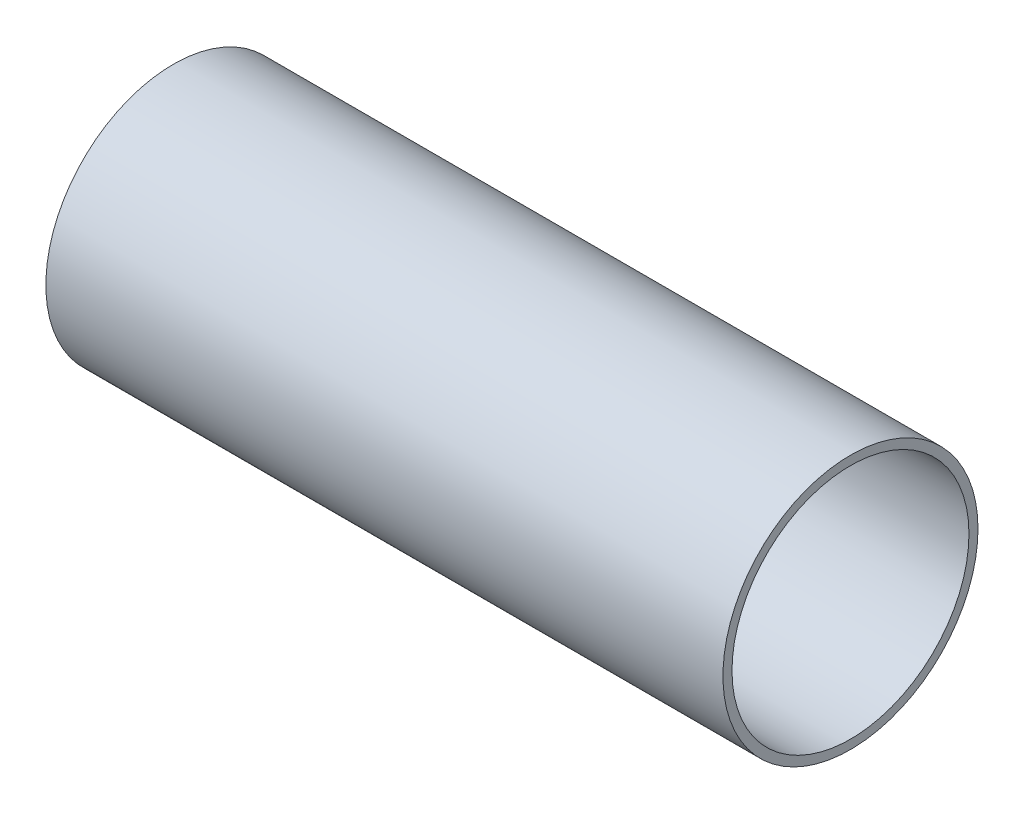
ISO-10303-21;
HEADER;
FILE_DESCRIPTION(('STEP AP214'),'2;1');
FILE_NAME('part.step','',(''),(''),'','','');
FILE_SCHEMA(('AUTOMOTIVE_DESIGN { 1 0 10303 214 1 1 1 1 }'));
ENDSEC;
DATA;
#1=APPLICATION_CONTEXT('core data for automotive mechanical design processes');
#2=APPLICATION_PROTOCOL_DEFINITION('international standard','automotive_design',2000,#1);
#3=PRODUCT_CONTEXT('',#1,'mechanical');
#4=PRODUCT('Part','Part','',(#3));
#5=PRODUCT_RELATED_PRODUCT_CATEGORY('part','',(#4));
#6=PRODUCT_DEFINITION_FORMATION('','',#4);
#7=PRODUCT_DEFINITION_CONTEXT('part definition',#1,'design');
#8=PRODUCT_DEFINITION('design','',#6,#7);
#9=PRODUCT_DEFINITION_SHAPE('','',#8);
#10=(LENGTH_UNIT() NAMED_UNIT(*) SI_UNIT(.MILLI.,.METRE.));
#11=(NAMED_UNIT(*) PLANE_ANGLE_UNIT() SI_UNIT($,.RADIAN.));
#12=(NAMED_UNIT(*) SI_UNIT($,.STERADIAN.) SOLID_ANGLE_UNIT());
#13=UNCERTAINTY_MEASURE_WITH_UNIT(LENGTH_MEASURE(1.E-05),#10,'distance_accuracy_value','');
#14=(GEOMETRIC_REPRESENTATION_CONTEXT(3) GLOBAL_UNCERTAINTY_ASSIGNED_CONTEXT((#13)) GLOBAL_UNIT_ASSIGNED_CONTEXT((#10,
#11,#12)) REPRESENTATION_CONTEXT('',''));
#15=CARTESIAN_POINT('',(0.,0.,0.));
#16=DIRECTION('',(0.,0.,1.));
#17=DIRECTION('',(1.,0.,0.));
#18=AXIS2_PLACEMENT_3D('',#15,#16,#17);
#19=CARTESIAN_POINT('',(300.,0.,0.));
#20=DIRECTION('',(1.,0.,0.));
#21=DIRECTION('',(0.,0.,-1.));
#22=AXIS2_PLACEMENT_3D('',#19,#20,#21);
#23=PLANE('',#22);
#24=CARTESIAN_POINT('',(300.,0.,0.));
#25=DIRECTION('',(1.,0.,0.));
#26=DIRECTION('',(0.,0.,-1.));
#27=AXIS2_PLACEMENT_3D('',#24,#25,#26);
#28=CIRCLE('',#27,56.5);
#29=CARTESIAN_POINT('',(300.,0.,-56.5));
#30=VERTEX_POINT('',#29);
#31=EDGE_CURVE('E10',#30,#30,#28,.T.);
#32=ORIENTED_EDGE('',*,*,#31,.T.);
#33=EDGE_LOOP('',(#32));
#34=FACE_BOUND('',#33,.T.);
#35=CARTESIAN_POINT('',(300.,0.,0.));
#36=DIRECTION('',(1.,0.,0.));
#37=DIRECTION('',(0.,0.,-1.));
#38=AXIS2_PLACEMENT_3D('',#35,#36,#37);
#39=CIRCLE('',#38,52.5);
#40=CARTESIAN_POINT('',(300.,0.,-52.5));
#41=VERTEX_POINT('',#40);
#42=EDGE_CURVE('E42',#41,#41,#39,.T.);
#43=ORIENTED_EDGE('',*,*,#42,.F.);
#44=EDGE_LOOP('',(#43));
#45=FACE_BOUND('',#44,.T.);
#46=ADVANCED_FACE('F31',(#34,#45),#23,.T.);
#47=CARTESIAN_POINT('',(0.,0.,0.));
#48=DIRECTION('',(1.,0.,0.));
#49=DIRECTION('',(0.,0.,-1.));
#50=AXIS2_PLACEMENT_3D('',#47,#48,#49);
#51=PLANE('',#50);
#52=CARTESIAN_POINT('',(0.,0.,0.));
#53=DIRECTION('',(1.,0.,0.));
#54=DIRECTION('',(0.,0.,-1.));
#55=AXIS2_PLACEMENT_3D('',#52,#53,#54);
#56=CIRCLE('',#55,56.5);
#57=CARTESIAN_POINT('',(0.,0.,-56.5));
#58=VERTEX_POINT('',#57);
#59=EDGE_CURVE('E35',#58,#58,#56,.T.);
#60=ORIENTED_EDGE('',*,*,#59,.F.);
#61=EDGE_LOOP('',(#60));
#62=FACE_BOUND('',#61,.T.);
#63=CARTESIAN_POINT('',(0.,0.,0.));
#64=DIRECTION('',(1.,0.,0.));
#65=DIRECTION('',(0.,0.,-1.));
#66=AXIS2_PLACEMENT_3D('',#63,#64,#65);
#67=CIRCLE('',#66,52.5);
#68=CARTESIAN_POINT('',(0.,0.,-52.5));
#69=VERTEX_POINT('',#68);
#70=EDGE_CURVE('E44',#69,#69,#67,.T.);
#71=ORIENTED_EDGE('',*,*,#70,.T.);
#72=EDGE_LOOP('',(#71));
#73=FACE_BOUND('',#72,.T.);
#74=ADVANCED_FACE('F54',(#62,#73),#51,.F.);
#75=CARTESIAN_POINT('',(300.,0.,0.));
#76=DIRECTION('',(-1.,0.,0.));
#77=DIRECTION('',(0.,0.,1.));
#78=AXIS2_PLACEMENT_3D('',#75,#76,#77);
#79=CYLINDRICAL_SURFACE('',#78,56.5);
#80=ORIENTED_EDGE('',*,*,#31,.F.);
#81=EDGE_LOOP('',(#80));
#82=FACE_BOUND('',#81,.T.);
#83=ORIENTED_EDGE('',*,*,#59,.T.);
#84=EDGE_LOOP('',(#83));
#85=FACE_BOUND('',#84,.T.);
#86=ADVANCED_FACE('F33',(#82,#85),#79,.T.);
#87=CARTESIAN_POINT('',(300.,0.,0.));
#88=DIRECTION('',(-1.,0.,0.));
#89=DIRECTION('',(0.,0.,1.));
#90=AXIS2_PLACEMENT_3D('',#87,#88,#89);
#91=CYLINDRICAL_SURFACE('',#90,52.5);
#92=ORIENTED_EDGE('',*,*,#42,.T.);
#93=EDGE_LOOP('',(#92));
#94=FACE_BOUND('',#93,.T.);
#95=ORIENTED_EDGE('',*,*,#70,.F.);
#96=EDGE_LOOP('',(#95));
#97=FACE_BOUND('',#96,.T.);
#98=ADVANCED_FACE('F50',(#94,#97),#91,.F.);
#99=CLOSED_SHELL('',(#46,#74,#86,#98));
#100=MANIFOLD_SOLID_BREP('B2',#99);
#101=ADVANCED_BREP_SHAPE_REPRESENTATION('',(#18,#100),#14);
#102=SHAPE_DEFINITION_REPRESENTATION(#9,#101);
ENDSEC;
END-ISO-10303-21;
